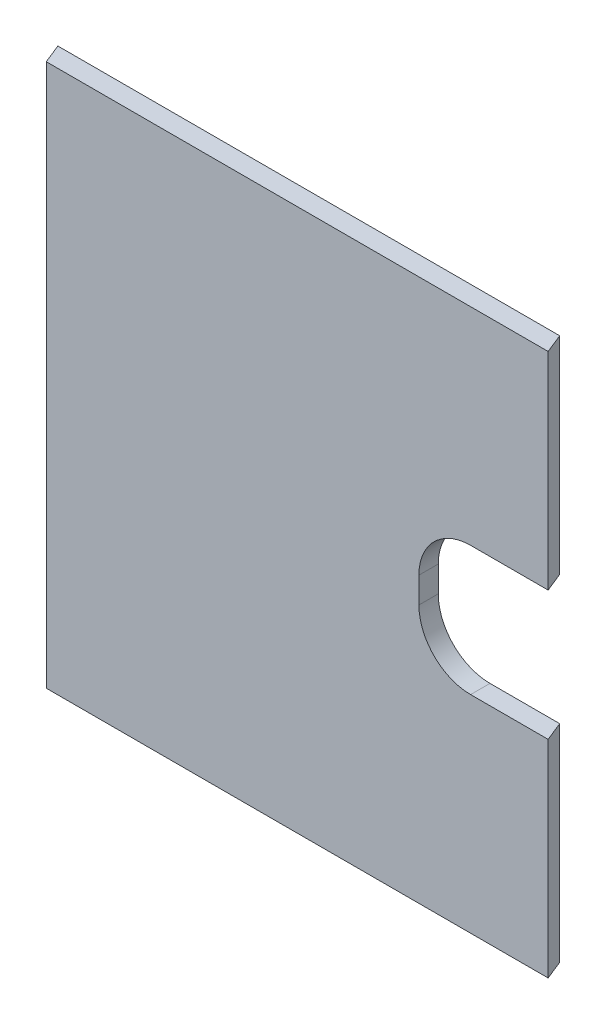
ISO-10303-21;
HEADER;
FILE_DESCRIPTION(('STEP AP214'),'2;1');
FILE_NAME('part.step','',(''),(''),'','','');
FILE_SCHEMA(('AUTOMOTIVE_DESIGN { 1 0 10303 214 1 1 1 1 }'));
ENDSEC;
DATA;
#1=APPLICATION_CONTEXT('core data for automotive mechanical design processes');
#2=APPLICATION_PROTOCOL_DEFINITION('international standard','automotive_design',2000,#1);
#3=PRODUCT_CONTEXT('',#1,'mechanical');
#4=PRODUCT('Part','Part','',(#3));
#5=PRODUCT_RELATED_PRODUCT_CATEGORY('part','',(#4));
#6=PRODUCT_DEFINITION_FORMATION('','',#4);
#7=PRODUCT_DEFINITION_CONTEXT('part definition',#1,'design');
#8=PRODUCT_DEFINITION('design','',#6,#7);
#9=PRODUCT_DEFINITION_SHAPE('','',#8);
#10=(LENGTH_UNIT() NAMED_UNIT(*) SI_UNIT(.MILLI.,.METRE.));
#11=(NAMED_UNIT(*) PLANE_ANGLE_UNIT() SI_UNIT($,.RADIAN.));
#12=(NAMED_UNIT(*) SI_UNIT($,.STERADIAN.) SOLID_ANGLE_UNIT());
#13=UNCERTAINTY_MEASURE_WITH_UNIT(LENGTH_MEASURE(1.E-05),#10,'distance_accuracy_value','');
#14=(GEOMETRIC_REPRESENTATION_CONTEXT(3) GLOBAL_UNCERTAINTY_ASSIGNED_CONTEXT((#13)) GLOBAL_UNIT_ASSIGNED_CONTEXT((#10,
#11,#12)) REPRESENTATION_CONTEXT('',''));
#15=CARTESIAN_POINT('',(0.,0.,0.));
#16=DIRECTION('',(0.,0.,1.));
#17=DIRECTION('',(1.,0.,0.));
#18=AXIS2_PLACEMENT_3D('',#15,#16,#17);
#19=CARTESIAN_POINT('',(0.,0.,19.05));
#20=DIRECTION('',(0.,0.,1.));
#21=DIRECTION('',(1.,0.,0.));
#22=AXIS2_PLACEMENT_3D('',#19,#20,#21);
#23=PLANE('',#22);
#24=DIRECTION('',(0.,-1.,0.));
#25=VECTOR('',#24,1.);
#26=CARTESIAN_POINT('',(-5095.45074854631,330.073000000001,19.05));
#27=LINE('',#26,#25);
#28=CARTESIAN_POINT('',(-5095.45074854631,279.273000000001,19.05));
#29=VERTEX_POINT('',#28);
#30=CARTESIAN_POINT('',(-5095.45074854631,253.873000000001,19.05));
#31=VERTEX_POINT('',#30);
#32=EDGE_CURVE('E175',#29,#31,#27,.T.);
#33=ORIENTED_EDGE('',*,*,#32,.F.);
#34=CARTESIAN_POINT('',(-5044.65074854631,279.273000000001,19.05));
#35=DIRECTION('',(0.,0.,1.));
#36=DIRECTION('',(1.,0.,0.));
#37=AXIS2_PLACEMENT_3D('',#34,#35,#36);
#38=CIRCLE('',#37,50.8);
#39=CARTESIAN_POINT('',(-5044.65074854631,330.073000000001,19.05));
#40=VERTEX_POINT('',#39);
#41=EDGE_CURVE('E115',#29,#40,#38,.F.);
#42=ORIENTED_EDGE('',*,*,#41,.T.);
#43=DIRECTION('',(1.,0.,0.));
#44=VECTOR('',#43,1.);
#45=CARTESIAN_POINT('',(-5095.45074854631,330.073000000001,19.05));
#46=LINE('',#45,#44);
#47=CARTESIAN_POINT('',(-4968.45074854631,330.073000000001,19.05));
#48=VERTEX_POINT('',#47);
#49=EDGE_CURVE('E109',#40,#48,#46,.T.);
#50=ORIENTED_EDGE('',*,*,#49,.T.);
#51=DIRECTION('',(0.,-1.,0.));
#52=VECTOR('',#51,1.);
#53=CARTESIAN_POINT('',(-4968.45074854631,533.146000000001,19.05));
#54=LINE('',#53,#52);
#55=CARTESIAN_POINT('',(-4968.45074854631,533.146000000001,19.0499999999997));
#56=VERTEX_POINT('',#55);
#57=EDGE_CURVE('E114',#56,#48,#54,.T.);
#58=ORIENTED_EDGE('',*,*,#57,.F.);
#59=DIRECTION('',(-1.,0.,0.));
#60=VECTOR('',#59,1.);
#61=CARTESIAN_POINT('',(-4976.14744814867,533.146000000001,19.05));
#62=LINE('',#61,#60);
#63=CARTESIAN_POINT('',(-5461.55683289851,533.146000000001,19.0499999999997));
#64=VERTEX_POINT('',#63);
#65=EDGE_CURVE('E145',#56,#64,#62,.T.);
#66=ORIENTED_EDGE('',*,*,#65,.T.);
#67=DIRECTION('',(0.,1.,0.));
#68=VECTOR('',#67,1.);
#69=CARTESIAN_POINT('',(-5461.55683289851,-2.22044604925031E-13,19.0499999999997));
#70=LINE('',#69,#68);
#71=CARTESIAN_POINT('',(-5461.55683289851,-2.22044604925031E-13,19.0499999999997));
#72=VERTEX_POINT('',#71);
#73=EDGE_CURVE('E138',#72,#64,#70,.T.);
#74=ORIENTED_EDGE('',*,*,#73,.F.);
#75=DIRECTION('',(1.,0.,0.));
#76=VECTOR('',#75,1.);
#77=CARTESIAN_POINT('',(-4976.14744814867,-1.4658413372004E-13,19.05));
#78=LINE('',#77,#76);
#79=CARTESIAN_POINT('',(-4968.45074854631,8.85796643069524E-13,19.0499999999999));
#80=VERTEX_POINT('',#79);
#81=EDGE_CURVE('E147',#72,#80,#78,.T.);
#82=ORIENTED_EDGE('',*,*,#81,.T.);
#83=CARTESIAN_POINT('',(-4968.45074854631,203.073000000001,19.05));
#84=VERTEX_POINT('',#83);
#85=EDGE_CURVE('E134',#84,#80,#54,.T.);
#86=ORIENTED_EDGE('',*,*,#85,.F.);
#87=DIRECTION('',(1.,0.,0.));
#88=VECTOR('',#87,1.);
#89=CARTESIAN_POINT('',(-5095.45074854631,203.073000000001,19.05));
#90=LINE('',#89,#88);
#91=CARTESIAN_POINT('',(-5044.65074854631,203.073000000001,19.05));
#92=VERTEX_POINT('',#91);
#93=EDGE_CURVE('E118',#92,#84,#90,.T.);
#94=ORIENTED_EDGE('',*,*,#93,.F.);
#95=CARTESIAN_POINT('',(-5044.65074854631,253.873000000001,19.05));
#96=DIRECTION('',(0.,0.,1.));
#97=DIRECTION('',(1.,0.,0.));
#98=AXIS2_PLACEMENT_3D('',#95,#96,#97);
#99=CIRCLE('',#98,50.8);
#100=EDGE_CURVE('E41',#92,#31,#99,.F.);
#101=ORIENTED_EDGE('',*,*,#100,.T.);
#102=EDGE_LOOP('',(#33,#42,#50,#58,#66,#74,#82,#86,#94,#101));
#103=FACE_BOUND('',#102,.T.);
#104=ADVANCED_FACE('F33',(#103),#23,.T.);
#105=CARTESIAN_POINT('',(0.,0.,0.));
#106=DIRECTION('',(0.,0.,1.));
#107=DIRECTION('',(1.,0.,0.));
#108=AXIS2_PLACEMENT_3D('',#105,#106,#107);
#109=PLANE('',#108);
#110=DIRECTION('',(1.,0.,0.));
#111=VECTOR('',#110,1.);
#112=CARTESIAN_POINT('',(-5095.45074854631,330.073000000001,-4.92328400270026E-10));
#113=LINE('',#112,#111);
#114=CARTESIAN_POINT('',(-5044.65074854631,330.073000000001,-4.92328400270026E-10));
#115=VERTEX_POINT('',#114);
#116=CARTESIAN_POINT('',(-4976.14744814867,330.073000000001,-4.92328400270026E-10));
#117=VERTEX_POINT('',#116);
#118=EDGE_CURVE('E124',#115,#117,#113,.T.);
#119=ORIENTED_EDGE('',*,*,#118,.F.);
#120=CARTESIAN_POINT('',(-5044.65074854631,279.273000000001,0.));
#121=DIRECTION('',(0.,0.,1.));
#122=DIRECTION('',(1.,0.,0.));
#123=AXIS2_PLACEMENT_3D('',#120,#121,#122);
#124=CIRCLE('',#123,50.8);
#125=CARTESIAN_POINT('',(-5095.45074854631,279.273000000001,-4.92328400270026E-10));
#126=VERTEX_POINT('',#125);
#127=EDGE_CURVE('E172',#115,#126,#124,.T.);
#128=ORIENTED_EDGE('',*,*,#127,.T.);
#129=DIRECTION('',(0.,-1.,0.));
#130=VECTOR('',#129,1.);
#131=CARTESIAN_POINT('',(-5095.45074854631,330.073000000001,-4.92328400270026E-10));
#132=LINE('',#131,#130);
#133=CARTESIAN_POINT('',(-5095.45074854631,253.873000000001,-4.92328400270026E-10));
#134=VERTEX_POINT('',#133);
#135=EDGE_CURVE('E186',#126,#134,#132,.T.);
#136=ORIENTED_EDGE('',*,*,#135,.T.);
#137=CARTESIAN_POINT('',(-5044.65074854631,253.873000000001,0.));
#138=DIRECTION('',(0.,0.,1.));
#139=DIRECTION('',(1.,0.,0.));
#140=AXIS2_PLACEMENT_3D('',#137,#138,#139);
#141=CIRCLE('',#140,50.8);
#142=CARTESIAN_POINT('',(-5044.65074854631,203.073000000001,-4.92328400270026E-10));
#143=VERTEX_POINT('',#142);
#144=EDGE_CURVE('E11',#134,#143,#141,.T.);
#145=ORIENTED_EDGE('',*,*,#144,.T.);
#146=DIRECTION('',(1.,0.,0.));
#147=VECTOR('',#146,1.);
#148=CARTESIAN_POINT('',(-5095.45074854631,203.073000000001,-4.92328400270026E-10));
#149=LINE('',#148,#147);
#150=CARTESIAN_POINT('',(-4976.14744814867,203.073000000001,-4.92328400270026E-10));
#151=VERTEX_POINT('',#150);
#152=EDGE_CURVE('E185',#143,#151,#149,.T.);
#153=ORIENTED_EDGE('',*,*,#152,.T.);
#154=DIRECTION('',(0.,1.,0.));
#155=VECTOR('',#154,1.);
#156=CARTESIAN_POINT('',(-4976.14744814867,-1.4658413372004E-13,0.));
#157=LINE('',#156,#155);
#158=CARTESIAN_POINT('',(-4976.14744814867,-1.4658413372004E-13,0.));
#159=VERTEX_POINT('',#158);
#160=EDGE_CURVE('E151',#159,#151,#157,.T.);
#161=ORIENTED_EDGE('',*,*,#160,.F.);
#162=DIRECTION('',(1.,0.,0.));
#163=VECTOR('',#162,1.);
#164=CARTESIAN_POINT('',(-4976.14744814867,-1.4658413372004E-13,0.));
#165=LINE('',#164,#163);
#166=CARTESIAN_POINT('',(-5469.25353250067,-2.22044604925031E-13,0.));
#167=VERTEX_POINT('',#166);
#168=EDGE_CURVE('E148',#167,#159,#165,.T.);
#169=ORIENTED_EDGE('',*,*,#168,.F.);
#170=DIRECTION('',(0.,-1.,0.));
#171=VECTOR('',#170,1.);
#172=CARTESIAN_POINT('',(-5469.25353250067,-2.06972212504217E-13,0.));
#173=LINE('',#172,#171);
#174=CARTESIAN_POINT('',(-5469.25353250067,533.146000000001,0.));
#175=VERTEX_POINT('',#174);
#176=EDGE_CURVE('E157',#175,#167,#173,.T.);
#177=ORIENTED_EDGE('',*,*,#176,.F.);
#178=DIRECTION('',(-1.,0.,0.));
#179=VECTOR('',#178,1.);
#180=CARTESIAN_POINT('',(-4976.14744814867,533.146000000001,0.));
#181=LINE('',#180,#179);
#182=CARTESIAN_POINT('',(-4976.14744814867,533.146000000001,0.));
#183=VERTEX_POINT('',#182);
#184=EDGE_CURVE('E154',#183,#175,#181,.T.);
#185=ORIENTED_EDGE('',*,*,#184,.F.);
#186=EDGE_CURVE('E144',#117,#183,#157,.T.);
#187=ORIENTED_EDGE('',*,*,#186,.F.);
#188=EDGE_LOOP('',(#119,#128,#136,#145,#153,#161,#169,#177,#185,#187));
#189=FACE_BOUND('',#188,.T.);
#190=ADVANCED_FACE('F204',(#189),#109,.F.);
#191=CARTESIAN_POINT('',(-2488.10714377719,266.573000000001,6158.11584811843));
#192=DIRECTION('',(0.92718385456677,0.,-0.374606593415954));
#193=DIRECTION('',(0.,-1.,0.));
#194=AXIS2_PLACEMENT_3D('',#191,#192,#193);
#195=PLANE('',#194);
#196=ORIENTED_EDGE('',*,*,#57,.T.);
#197=DIRECTION('',(-0.374606593415954,0.,-0.92718385456677));
#198=VECTOR('',#197,1.);
#199=CARTESIAN_POINT('',(-2488.10714377719,330.073000000002,6158.11584811843));
#200=LINE('',#199,#198);
#201=EDGE_CURVE('E121',#48,#117,#200,.T.);
#202=ORIENTED_EDGE('',*,*,#201,.T.);
#203=ORIENTED_EDGE('',*,*,#186,.T.);
#204=DIRECTION('',(0.374606593415954,0.,0.92718385456677));
#205=VECTOR('',#204,1.);
#206=CARTESIAN_POINT('',(-4897.80351322395,533.146000000001,193.908043376562));
#207=LINE('',#206,#205);
#208=EDGE_CURVE('E133',#183,#56,#207,.T.);
#209=ORIENTED_EDGE('',*,*,#208,.T.);
#210=EDGE_LOOP('',(#196,#202,#203,#209));
#211=FACE_BOUND('',#210,.T.);
#212=ADVANCED_FACE('F131',(#211),#195,.T.);
#213=CARTESIAN_POINT('',(-4976.14744814867,533.146000000001,19.05));
#214=DIRECTION('',(0.,-1.,0.));
#215=DIRECTION('',(0.,0.,-1.));
#216=AXIS2_PLACEMENT_3D('',#213,#214,#215);
#217=PLANE('',#216);
#218=ORIENTED_EDGE('',*,*,#184,.T.);
#219=DIRECTION('',(-0.374606593415943,0.,-0.927183854566775));
#220=VECTOR('',#219,1.);
#221=CARTESIAN_POINT('',(-5469.25353250067,533.146000000001,0.));
#222=LINE('',#221,#220);
#223=EDGE_CURVE('E188',#64,#175,#222,.T.);
#224=ORIENTED_EDGE('',*,*,#223,.F.);
#225=ORIENTED_EDGE('',*,*,#65,.F.);
#226=ORIENTED_EDGE('',*,*,#208,.F.);
#227=EDGE_LOOP('',(#218,#224,#225,#226));
#228=FACE_BOUND('',#227,.T.);
#229=ADVANCED_FACE('F202',(#228),#217,.F.);
#230=CARTESIAN_POINT('',(-4976.14744814867,-1.4658413372004E-13,19.05));
#231=DIRECTION('',(0.,1.,0.));
#232=DIRECTION('',(-1.,0.,0.));
#233=AXIS2_PLACEMENT_3D('',#230,#231,#232);
#234=PLANE('',#233);
#235=ORIENTED_EDGE('',*,*,#81,.F.);
#236=DIRECTION('',(-0.374606593415943,0.,-0.927183854566775));
#237=VECTOR('',#236,1.);
#238=CARTESIAN_POINT('',(-5469.25353250067,-2.22044604925031E-13,0.));
#239=LINE('',#238,#237);
#240=EDGE_CURVE('E193',#72,#167,#239,.T.);
#241=ORIENTED_EDGE('',*,*,#240,.T.);
#242=ORIENTED_EDGE('',*,*,#168,.T.);
#243=DIRECTION('',(-0.374606593415954,0.,-0.92718385456677));
#244=VECTOR('',#243,1.);
#245=CARTESIAN_POINT('',(-4891.18689224533,-1.4658413372004E-13,210.284754974787));
#246=LINE('',#245,#244);
#247=EDGE_CURVE('E136',#80,#159,#246,.T.);
#248=ORIENTED_EDGE('',*,*,#247,.F.);
#249=EDGE_LOOP('',(#235,#241,#242,#248));
#250=FACE_BOUND('',#249,.T.);
#251=ADVANCED_FACE('F208',(#250),#234,.F.);
#252=DIRECTION('',(-0.374606593415954,0.,-0.92718385456677));
#253=VECTOR('',#252,1.);
#254=CARTESIAN_POINT('',(-2488.10714377719,203.073000000001,6158.11584811843));
#255=LINE('',#254,#253);
#256=EDGE_CURVE('E128',#84,#151,#255,.T.);
#257=ORIENTED_EDGE('',*,*,#256,.F.);
#258=ORIENTED_EDGE('',*,*,#85,.T.);
#259=ORIENTED_EDGE('',*,*,#247,.T.);
#260=ORIENTED_EDGE('',*,*,#160,.T.);
#261=EDGE_LOOP('',(#257,#258,#259,#260));
#262=FACE_BOUND('',#261,.T.);
#263=ADVANCED_FACE('F210',(#262),#195,.T.);
#264=CARTESIAN_POINT('',(-5469.25353250067,-2.22044604925031E-13,0.));
#265=DIRECTION('',(0.927183854566775,0.,-0.374606593415943));
#266=DIRECTION('',(-0.374606593415943,0.,-0.927183854566775));
#267=AXIS2_PLACEMENT_3D('',#264,#265,#266);
#268=PLANE('',#267);
#269=ORIENTED_EDGE('',*,*,#223,.T.);
#270=ORIENTED_EDGE('',*,*,#176,.T.);
#271=ORIENTED_EDGE('',*,*,#240,.F.);
#272=ORIENTED_EDGE('',*,*,#73,.T.);
#273=EDGE_LOOP('',(#269,#270,#271,#272));
#274=FACE_BOUND('',#273,.T.);
#275=ADVANCED_FACE('F197',(#274),#268,.F.);
#276=CARTESIAN_POINT('',(-5095.45074854631,330.073000000001,-4.92328400270026E-10));
#277=DIRECTION('',(0.,-1.,0.));
#278=DIRECTION('',(1.,0.,0.));
#279=AXIS2_PLACEMENT_3D('',#276,#277,#278);
#280=PLANE('',#279);
#281=ORIENTED_EDGE('',*,*,#49,.F.);
#282=DIRECTION('',(0.,0.,1.));
#283=VECTOR('',#282,1.);
#284=CARTESIAN_POINT('',(-5044.65074854631,330.073000000001,-4.92328400270026E-10));
#285=LINE('',#284,#283);
#286=EDGE_CURVE('E167',#40,#115,#285,.F.);
#287=ORIENTED_EDGE('',*,*,#286,.T.);
#288=ORIENTED_EDGE('',*,*,#118,.T.);
#289=ORIENTED_EDGE('',*,*,#201,.F.);
#290=EDGE_LOOP('',(#281,#287,#288,#289));
#291=FACE_BOUND('',#290,.T.);
#292=ADVANCED_FACE('F122',(#291),#280,.T.);
#293=CARTESIAN_POINT('',(-5095.45074854631,203.073000000001,-4.92328400270026E-10));
#294=DIRECTION('',(0.,-1.,0.));
#295=DIRECTION('',(0.,0.,-1.));
#296=AXIS2_PLACEMENT_3D('',#293,#294,#295);
#297=PLANE('',#296);
#298=ORIENTED_EDGE('',*,*,#152,.F.);
#299=DIRECTION('',(0.,0.,1.));
#300=VECTOR('',#299,1.);
#301=CARTESIAN_POINT('',(-5044.65074854631,203.073000000001,19.05));
#302=LINE('',#301,#300);
#303=EDGE_CURVE('E169',#143,#92,#302,.T.);
#304=ORIENTED_EDGE('',*,*,#303,.T.);
#305=ORIENTED_EDGE('',*,*,#93,.T.);
#306=ORIENTED_EDGE('',*,*,#256,.T.);
#307=EDGE_LOOP('',(#298,#304,#305,#306));
#308=FACE_BOUND('',#307,.T.);
#309=ADVANCED_FACE('F183',(#308),#297,.F.);
#310=CARTESIAN_POINT('',(-5095.45074854631,330.073000000001,-4.92328400270026E-10));
#311=DIRECTION('',(-1.,0.,0.));
#312=DIRECTION('',(0.,-1.,0.));
#313=AXIS2_PLACEMENT_3D('',#310,#311,#312);
#314=PLANE('',#313);
#315=ORIENTED_EDGE('',*,*,#135,.F.);
#316=DIRECTION('',(0.,0.,1.));
#317=VECTOR('',#316,1.);
#318=CARTESIAN_POINT('',(-5095.45074854631,279.273000000001,-4.92328400270026E-10));
#319=LINE('',#318,#317);
#320=EDGE_CURVE('E164',#126,#29,#319,.T.);
#321=ORIENTED_EDGE('',*,*,#320,.T.);
#322=ORIENTED_EDGE('',*,*,#32,.T.);
#323=DIRECTION('',(0.,0.,1.));
#324=VECTOR('',#323,1.);
#325=CARTESIAN_POINT('',(-5095.45074854631,253.873000000001,-4.92328400270026E-10));
#326=LINE('',#325,#324);
#327=EDGE_CURVE('E127',#31,#134,#326,.F.);
#328=ORIENTED_EDGE('',*,*,#327,.T.);
#329=EDGE_LOOP('',(#315,#321,#322,#328));
#330=FACE_BOUND('',#329,.T.);
#331=ADVANCED_FACE('F179',(#330),#314,.F.);
#332=CARTESIAN_POINT('',(-5044.65074854631,279.273000000001,-4.92328400270026E-10));
#333=DIRECTION('',(0.,0.,1.));
#334=DIRECTION('',(1.,0.,0.));
#335=AXIS2_PLACEMENT_3D('',#332,#333,#334);
#336=CYLINDRICAL_SURFACE('',#335,50.8);
#337=ORIENTED_EDGE('',*,*,#127,.F.);
#338=ORIENTED_EDGE('',*,*,#286,.F.);
#339=ORIENTED_EDGE('',*,*,#41,.F.);
#340=ORIENTED_EDGE('',*,*,#320,.F.);
#341=EDGE_LOOP('',(#337,#338,#339,#340));
#342=FACE_BOUND('',#341,.T.);
#343=ADVANCED_FACE('F228',(#342),#336,.F.);
#344=CARTESIAN_POINT('',(-5044.65074854631,253.873000000001,-4.92328400270026E-10));
#345=DIRECTION('',(0.,0.,-1.));
#346=DIRECTION('',(-1.,0.,0.));
#347=AXIS2_PLACEMENT_3D('',#344,#345,#346);
#348=CYLINDRICAL_SURFACE('',#347,50.8);
#349=ORIENTED_EDGE('',*,*,#144,.F.);
#350=ORIENTED_EDGE('',*,*,#327,.F.);
#351=ORIENTED_EDGE('',*,*,#100,.F.);
#352=ORIENTED_EDGE('',*,*,#303,.F.);
#353=EDGE_LOOP('',(#349,#350,#351,#352));
#354=FACE_BOUND('',#353,.T.);
#355=ADVANCED_FACE('F35',(#354),#348,.F.);
#356=CLOSED_SHELL('',(#104,#190,#212,#229,#251,#263,#275,#292,#309,#331,#343,#355));
#357=MANIFOLD_SOLID_BREP('B2',#356);
#358=ADVANCED_BREP_SHAPE_REPRESENTATION('',(#18,#357),#14);
#359=SHAPE_DEFINITION_REPRESENTATION(#9,#358);
ENDSEC;
END-ISO-10303-21;
